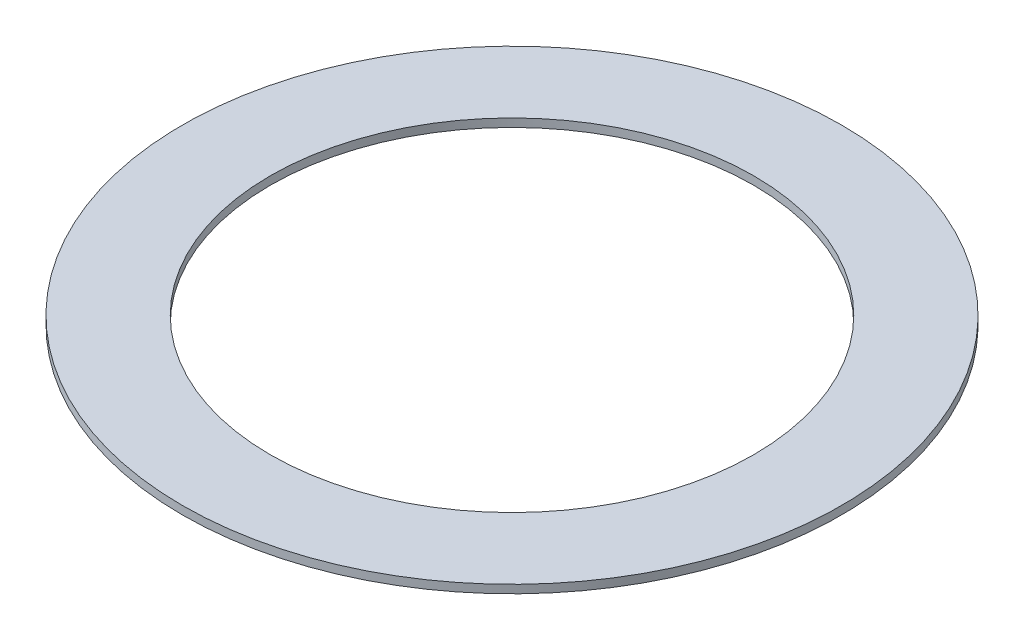
ISO-10303-21;
HEADER;
FILE_DESCRIPTION(('STEP AP214'),'2;1');
FILE_NAME('part.step','',(''),(''),'','','');
FILE_SCHEMA(('AUTOMOTIVE_DESIGN { 1 0 10303 214 1 1 1 1 }'));
ENDSEC;
DATA;
#1=APPLICATION_CONTEXT('core data for automotive mechanical design processes');
#2=APPLICATION_PROTOCOL_DEFINITION('international standard','automotive_design',2000,#1);
#3=PRODUCT_CONTEXT('',#1,'mechanical');
#4=PRODUCT('Part','Part','',(#3));
#5=PRODUCT_RELATED_PRODUCT_CATEGORY('part','',(#4));
#6=PRODUCT_DEFINITION_FORMATION('','',#4);
#7=PRODUCT_DEFINITION_CONTEXT('part definition',#1,'design');
#8=PRODUCT_DEFINITION('design','',#6,#7);
#9=PRODUCT_DEFINITION_SHAPE('','',#8);
#10=(LENGTH_UNIT() NAMED_UNIT(*) SI_UNIT(.MILLI.,.METRE.));
#11=(NAMED_UNIT(*) PLANE_ANGLE_UNIT() SI_UNIT($,.RADIAN.));
#12=(NAMED_UNIT(*) SI_UNIT($,.STERADIAN.) SOLID_ANGLE_UNIT());
#13=UNCERTAINTY_MEASURE_WITH_UNIT(LENGTH_MEASURE(1.E-05),#10,'distance_accuracy_value','');
#14=(GEOMETRIC_REPRESENTATION_CONTEXT(3) GLOBAL_UNCERTAINTY_ASSIGNED_CONTEXT((#13)) GLOBAL_UNIT_ASSIGNED_CONTEXT((#10,
#11,#12)) REPRESENTATION_CONTEXT('',''));
#15=CARTESIAN_POINT('',(0.,0.,0.));
#16=DIRECTION('',(0.,0.,1.));
#17=DIRECTION('',(1.,0.,0.));
#18=AXIS2_PLACEMENT_3D('',#15,#16,#17);
#19=CARTESIAN_POINT('',(0.,0.2,0.));
#20=DIRECTION('',(0.,-1.,0.));
#21=DIRECTION('',(0.,0.,-1.));
#22=AXIS2_PLACEMENT_3D('',#19,#20,#21);
#23=CYLINDRICAL_SURFACE('',#22,8.001);
#24=CARTESIAN_POINT('',(0.,0.2,0.));
#25=DIRECTION('',(0.,1.,0.));
#26=DIRECTION('',(0.,0.,1.));
#27=AXIS2_PLACEMENT_3D('',#24,#25,#26);
#28=CIRCLE('',#27,8.001);
#29=CARTESIAN_POINT('',(0.,0.2,8.001));
#30=VERTEX_POINT('',#29);
#31=EDGE_CURVE('E10',#30,#30,#28,.T.);
#32=ORIENTED_EDGE('',*,*,#31,.F.);
#33=EDGE_LOOP('',(#32));
#34=FACE_BOUND('',#33,.T.);
#35=CARTESIAN_POINT('',(0.,0.,0.));
#36=DIRECTION('',(0.,1.,0.));
#37=DIRECTION('',(0.,0.,1.));
#38=AXIS2_PLACEMENT_3D('',#35,#36,#37);
#39=CIRCLE('',#38,8.001);
#40=CARTESIAN_POINT('',(0.,0.,8.001));
#41=VERTEX_POINT('',#40);
#42=EDGE_CURVE('E44',#41,#41,#39,.T.);
#43=ORIENTED_EDGE('',*,*,#42,.T.);
#44=EDGE_LOOP('',(#43));
#45=FACE_BOUND('',#44,.T.);
#46=ADVANCED_FACE('F41',(#34,#45),#23,.T.);
#47=CARTESIAN_POINT('',(0.,0.2,0.));
#48=DIRECTION('',(0.,1.,0.));
#49=DIRECTION('',(0.,0.,1.));
#50=AXIS2_PLACEMENT_3D('',#47,#48,#49);
#51=PLANE('',#50);
#52=CARTESIAN_POINT('',(0.,0.2,0.));
#53=DIRECTION('',(0.,-1.,0.));
#54=DIRECTION('',(0.,0.,-1.));
#55=AXIS2_PLACEMENT_3D('',#52,#53,#54);
#56=CIRCLE('',#55,5.8674);
#57=CARTESIAN_POINT('',(0.,0.2,-5.8674));
#58=VERTEX_POINT('',#57);
#59=EDGE_CURVE('E53',#58,#58,#56,.T.);
#60=ORIENTED_EDGE('',*,*,#59,.T.);
#61=EDGE_LOOP('',(#60));
#62=FACE_BOUND('',#61,.T.);
#63=ORIENTED_EDGE('',*,*,#31,.T.);
#64=EDGE_LOOP('',(#63));
#65=FACE_BOUND('',#64,.T.);
#66=ADVANCED_FACE('F63',(#62,#65),#51,.T.);
#67=CARTESIAN_POINT('',(0.,0.,0.));
#68=DIRECTION('',(0.,1.,0.));
#69=DIRECTION('',(0.,0.,1.));
#70=AXIS2_PLACEMENT_3D('',#67,#68,#69);
#71=PLANE('',#70);
#72=CARTESIAN_POINT('',(0.,0.,0.));
#73=DIRECTION('',(0.,-1.,0.));
#74=DIRECTION('',(0.,0.,-1.));
#75=AXIS2_PLACEMENT_3D('',#72,#73,#74);
#76=CIRCLE('',#75,5.8674);
#77=CARTESIAN_POINT('',(0.,0.,-5.8674));
#78=VERTEX_POINT('',#77);
#79=EDGE_CURVE('E55',#78,#78,#76,.T.);
#80=ORIENTED_EDGE('',*,*,#79,.F.);
#81=EDGE_LOOP('',(#80));
#82=FACE_BOUND('',#81,.T.);
#83=ORIENTED_EDGE('',*,*,#42,.F.);
#84=EDGE_LOOP('',(#83));
#85=FACE_BOUND('',#84,.T.);
#86=ADVANCED_FACE('F68',(#82,#85),#71,.F.);
#87=CARTESIAN_POINT('',(0.,0.2,0.));
#88=DIRECTION('',(0.,-1.,0.));
#89=DIRECTION('',(0.,0.,-1.));
#90=AXIS2_PLACEMENT_3D('',#87,#88,#89);
#91=CYLINDRICAL_SURFACE('',#90,5.8674);
#92=ORIENTED_EDGE('',*,*,#59,.F.);
#93=EDGE_LOOP('',(#92));
#94=FACE_BOUND('',#93,.T.);
#95=ORIENTED_EDGE('',*,*,#79,.T.);
#96=EDGE_LOOP('',(#95));
#97=FACE_BOUND('',#96,.T.);
#98=ADVANCED_FACE('F65',(#94,#97),#91,.F.);
#99=CLOSED_SHELL('',(#46,#66,#86,#98));
#100=MANIFOLD_SOLID_BREP('B2',#99);
#101=ADVANCED_BREP_SHAPE_REPRESENTATION('',(#18,#100),#14);
#102=SHAPE_DEFINITION_REPRESENTATION(#9,#101);
ENDSEC;
END-ISO-10303-21;
